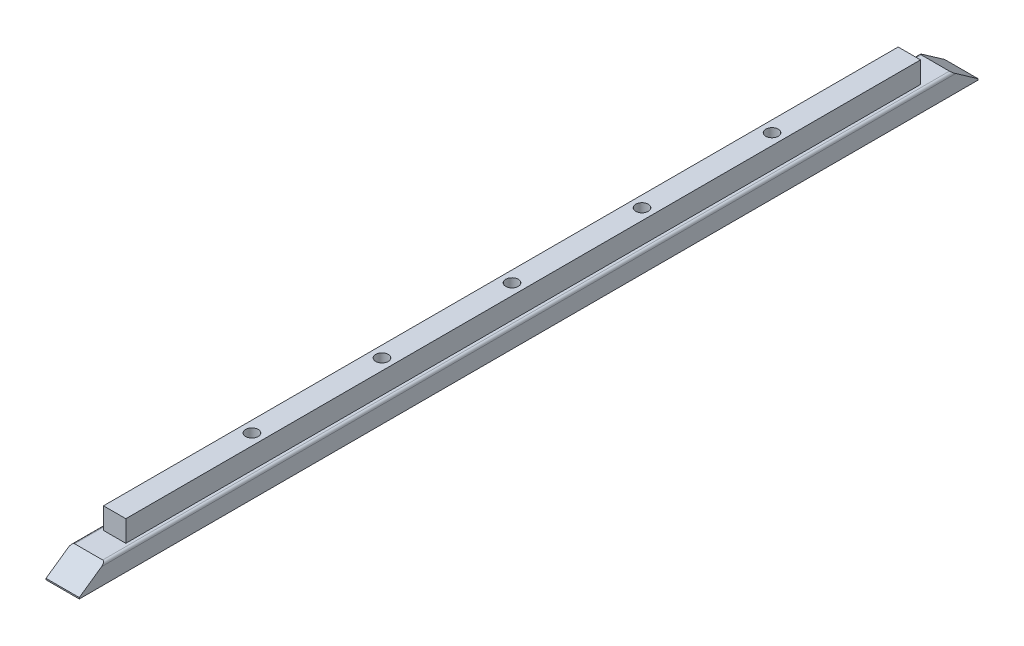
ISO-10303-21;
HEADER;
FILE_DESCRIPTION(('STEP AP214'),'2;1');
FILE_NAME('part.step','',(''),(''),'','','');
FILE_SCHEMA(('AUTOMOTIVE_DESIGN { 1 0 10303 214 1 1 1 1 }'));
ENDSEC;
DATA;
#1=APPLICATION_CONTEXT('core data for automotive mechanical design processes');
#2=APPLICATION_PROTOCOL_DEFINITION('international standard','automotive_design',2000,#1);
#3=PRODUCT_CONTEXT('',#1,'mechanical');
#4=PRODUCT('Part','Part','',(#3));
#5=PRODUCT_RELATED_PRODUCT_CATEGORY('part','',(#4));
#6=PRODUCT_DEFINITION_FORMATION('','',#4);
#7=PRODUCT_DEFINITION_CONTEXT('part definition',#1,'design');
#8=PRODUCT_DEFINITION('design','',#6,#7);
#9=PRODUCT_DEFINITION_SHAPE('','',#8);
#10=(LENGTH_UNIT() NAMED_UNIT(*) SI_UNIT(.MILLI.,.METRE.));
#11=(NAMED_UNIT(*) PLANE_ANGLE_UNIT() SI_UNIT($,.RADIAN.));
#12=(NAMED_UNIT(*) SI_UNIT($,.STERADIAN.) SOLID_ANGLE_UNIT());
#13=UNCERTAINTY_MEASURE_WITH_UNIT(LENGTH_MEASURE(1.E-05),#10,'distance_accuracy_value','');
#14=(GEOMETRIC_REPRESENTATION_CONTEXT(3) GLOBAL_UNCERTAINTY_ASSIGNED_CONTEXT((#13)) GLOBAL_UNIT_ASSIGNED_CONTEXT((#10,
#11,#12)) REPRESENTATION_CONTEXT('',''));
#15=CARTESIAN_POINT('',(0.,0.,0.));
#16=DIRECTION('',(0.,0.,1.));
#17=DIRECTION('',(1.,0.,0.));
#18=AXIS2_PLACEMENT_3D('',#15,#16,#17);
#19=CARTESIAN_POINT('',(2.39066431369243,3.75000000000887,176.480120000002));
#20=DIRECTION('',(2.39450679622574E-13,-1.,0.));
#21=DIRECTION('',(1.52957194753946E-07,0.,0.999999999999988));
#22=AXIS2_PLACEMENT_3D('',#19,#20,#21);
#23=PLANE('',#22);
#24=DIRECTION('',(-1.,-2.39450679622574E-13,0.));
#25=VECTOR('',#24,1.);
#26=CARTESIAN_POINT('',(2.39066431369243,3.75000000001107,-5.));
#27=LINE('',#26,#25);
#28=CARTESIAN_POINT('',(2.69999999999988,3.75000000001115,-5.));
#29=VERTEX_POINT('',#28);
#30=CARTESIAN_POINT('',(-2.70000000000012,3.75000000000985,-5.));
#31=VERTEX_POINT('',#30);
#32=EDGE_CURVE('E192',#29,#31,#27,.T.);
#33=ORIENTED_EDGE('',*,*,#32,.T.);
#34=DIRECTION('',(0.,0.,-1.));
#35=VECTOR('',#34,1.);
#36=CARTESIAN_POINT('',(-2.70000000000012,3.75000000000766,176.480120000002));
#37=LINE('',#36,#35);
#38=CARTESIAN_POINT('',(-2.70000000000012,3.75000000000788,157.800000000001));
#39=VERTEX_POINT('',#38);
#40=EDGE_CURVE('E215',#31,#39,#37,.F.);
#41=ORIENTED_EDGE('',*,*,#40,.T.);
#42=DIRECTION('',(1.,2.39450679622574E-13,0.));
#43=VECTOR('',#42,1.);
#44=CARTESIAN_POINT('',(2.39066431369243,3.7500000000091,157.800000000001));
#45=LINE('',#44,#43);
#46=CARTESIAN_POINT('',(2.69999999999989,3.75000000000917,157.800000000001));
#47=VERTEX_POINT('',#46);
#48=EDGE_CURVE('E195',#39,#47,#45,.T.);
#49=ORIENTED_EDGE('',*,*,#48,.T.);
#50=DIRECTION('',(0.,0.,1.));
#51=VECTOR('',#50,1.);
#52=CARTESIAN_POINT('',(2.69999999999989,3.75000000000895,176.480120000002));
#53=LINE('',#52,#51);
#54=EDGE_CURVE('E213',#47,#29,#53,.F.);
#55=ORIENTED_EDGE('',*,*,#54,.T.);
#56=EDGE_LOOP('',(#33,#41,#49,#55));
#57=FACE_BOUND('',#56,.T.);
#58=DIRECTION('',(0.,0.,1.));
#59=VECTOR('',#58,1.);
#60=CARTESIAN_POINT('',(-2.15000000001858,3.75000000000992,0.));
#61=LINE('',#60,#59);
#62=CARTESIAN_POINT('',(-2.15000000001858,3.75000000000992,0.));
#63=VERTEX_POINT('',#62);
#64=CARTESIAN_POINT('',(-2.15000000001954,3.75000000000807,152.800000000001));
#65=VERTEX_POINT('',#64);
#66=EDGE_CURVE('E158',#63,#65,#61,.T.);
#67=ORIENTED_EDGE('',*,*,#66,.F.);
#68=DIRECTION('',(-1.,-2.39432182091122E-13,0.));
#69=VECTOR('',#68,1.);
#70=CARTESIAN_POINT('',(-2.15000000001858,3.75000000000992,0.));
#71=LINE('',#70,#69);
#72=CARTESIAN_POINT('',(2.14999999998312,3.75000000001095,0.));
#73=VERTEX_POINT('',#72);
#74=EDGE_CURVE('E136',#73,#63,#71,.T.);
#75=ORIENTED_EDGE('',*,*,#74,.F.);
#76=DIRECTION('',(0.,0.,-1.));
#77=VECTOR('',#76,1.);
#78=CARTESIAN_POINT('',(2.14999999998312,3.75000000001095,0.));
#79=LINE('',#78,#77);
#80=CARTESIAN_POINT('',(2.14999999998314,3.7500000000091,152.800000000001));
#81=VERTEX_POINT('',#80);
#82=EDGE_CURVE('E61',#81,#73,#79,.T.);
#83=ORIENTED_EDGE('',*,*,#82,.F.);
#84=DIRECTION('',(1.,2.39432182091122E-13,0.));
#85=VECTOR('',#84,1.);
#86=CARTESIAN_POINT('',(-2.15000000001856,3.75000000000807,152.800000000001));
#87=LINE('',#86,#85);
#88=EDGE_CURVE('E56',#65,#81,#87,.T.);
#89=ORIENTED_EDGE('',*,*,#88,.F.);
#90=EDGE_LOOP('',(#67,#75,#83,#89));
#91=FACE_BOUND('',#90,.T.);
#92=ADVANCED_FACE('F41',(#57,#91),#23,.F.);
#93=CARTESIAN_POINT('',(0.,0.,0.));
#94=DIRECTION('',(0.,-1.,0.));
#95=DIRECTION('',(0.,0.,-1.));
#96=AXIS2_PLACEMENT_3D('',#93,#94,#95);
#97=PLANE('',#96);
#98=CARTESIAN_POINT('',(0.,0.,26.4000000000003));
#99=DIRECTION('',(0.,-1.,0.));
#100=DIRECTION('',(0.,0.,-1.));
#101=AXIS2_PLACEMENT_3D('',#98,#99,#100);
#102=CIRCLE('',#101,2.2);
#103=CARTESIAN_POINT('',(0.,0.,24.2000000000003));
#104=VERTEX_POINT('',#103);
#105=EDGE_CURVE('E334',#104,#104,#102,.T.);
#106=ORIENTED_EDGE('',*,*,#105,.F.);
#107=EDGE_LOOP('',(#106));
#108=FACE_BOUND('',#107,.T.);
#109=CARTESIAN_POINT('',(0.,0.,51.4000000000003));
#110=DIRECTION('',(0.,-1.,0.));
#111=DIRECTION('',(0.,0.,-1.));
#112=AXIS2_PLACEMENT_3D('',#109,#110,#111);
#113=CIRCLE('',#112,2.2);
#114=CARTESIAN_POINT('',(0.,0.,49.2000000000003));
#115=VERTEX_POINT('',#114);
#116=EDGE_CURVE('E341',#115,#115,#113,.T.);
#117=ORIENTED_EDGE('',*,*,#116,.F.);
#118=EDGE_LOOP('',(#117));
#119=FACE_BOUND('',#118,.T.);
#120=CARTESIAN_POINT('',(0.,0.,126.4));
#121=DIRECTION('',(0.,-1.,0.));
#122=DIRECTION('',(0.,0.,-1.));
#123=AXIS2_PLACEMENT_3D('',#120,#121,#122);
#124=CIRCLE('',#123,2.2);
#125=CARTESIAN_POINT('',(0.,0.,124.2));
#126=VERTEX_POINT('',#125);
#127=EDGE_CURVE('E350',#126,#126,#124,.T.);
#128=ORIENTED_EDGE('',*,*,#127,.F.);
#129=EDGE_LOOP('',(#128));
#130=FACE_BOUND('',#129,.T.);
#131=CARTESIAN_POINT('',(0.,0.,101.4));
#132=DIRECTION('',(0.,-1.,0.));
#133=DIRECTION('',(0.,0.,-1.));
#134=AXIS2_PLACEMENT_3D('',#131,#132,#133);
#135=CIRCLE('',#134,2.2);
#136=CARTESIAN_POINT('',(0.,0.,99.2000000000003));
#137=VERTEX_POINT('',#136);
#138=EDGE_CURVE('E359',#137,#137,#135,.T.);
#139=ORIENTED_EDGE('',*,*,#138,.F.);
#140=EDGE_LOOP('',(#139));
#141=FACE_BOUND('',#140,.T.);
#142=CARTESIAN_POINT('',(0.,0.,76.4000000000003));
#143=DIRECTION('',(0.,-1.,0.));
#144=DIRECTION('',(0.,0.,-1.));
#145=AXIS2_PLACEMENT_3D('',#142,#143,#144);
#146=CIRCLE('',#145,2.2);
#147=CARTESIAN_POINT('',(0.,0.,74.2000000000003));
#148=VERTEX_POINT('',#147);
#149=EDGE_CURVE('E368',#148,#148,#146,.T.);
#150=ORIENTED_EDGE('',*,*,#149,.F.);
#151=EDGE_LOOP('',(#150));
#152=FACE_BOUND('',#151,.T.);
#153=DIRECTION('',(0.,0.,-1.));
#154=VECTOR('',#153,1.);
#155=CARTESIAN_POINT('',(3.20000000000001,0.,162.800000000001));
#156=LINE('',#155,#154);
#157=CARTESIAN_POINT('',(3.20000000000001,0.,162.800000000001));
#158=VERTEX_POINT('',#157);
#159=CARTESIAN_POINT('',(3.2,0.,-10.));
#160=VERTEX_POINT('',#159);
#161=EDGE_CURVE('E151',#158,#160,#156,.T.);
#162=ORIENTED_EDGE('',*,*,#161,.F.);
#163=DIRECTION('',(1.,0.,0.));
#164=VECTOR('',#163,1.);
#165=CARTESIAN_POINT('',(-3.2,0.,162.800000000001));
#166=LINE('',#165,#164);
#167=CARTESIAN_POINT('',(-3.2,0.,162.800000000001));
#168=VERTEX_POINT('',#167);
#169=EDGE_CURVE('E173',#168,#158,#166,.T.);
#170=ORIENTED_EDGE('',*,*,#169,.F.);
#171=DIRECTION('',(0.,0.,1.));
#172=VECTOR('',#171,1.);
#173=CARTESIAN_POINT('',(-3.2,0.,162.800000000001));
#174=LINE('',#173,#172);
#175=CARTESIAN_POINT('',(-3.2,0.,-10.));
#176=VERTEX_POINT('',#175);
#177=EDGE_CURVE('E170',#176,#168,#174,.T.);
#178=ORIENTED_EDGE('',*,*,#177,.F.);
#179=DIRECTION('',(-1.,0.,0.));
#180=VECTOR('',#179,1.);
#181=CARTESIAN_POINT('',(-3.2,0.,-10.));
#182=LINE('',#181,#180);
#183=EDGE_CURVE('E154',#160,#176,#182,.T.);
#184=ORIENTED_EDGE('',*,*,#183,.F.);
#185=EDGE_LOOP('',(#162,#170,#178,#184));
#186=FACE_BOUND('',#185,.T.);
#187=ADVANCED_FACE('F251',(#108,#119,#130,#141,#152,#186),#97,.T.);
#188=CARTESIAN_POINT('',(-3.2,176.768477902171,162.800000000001));
#189=DIRECTION('',(0.,0.,-1.));
#190=DIRECTION('',(-1.,0.,0.));
#191=AXIS2_PLACEMENT_3D('',#188,#189,#190);
#192=PLANE('',#191);
#193=DIRECTION('',(0.,-1.,0.));
#194=VECTOR('',#193,1.);
#195=CARTESIAN_POINT('',(3.20000000000001,176.768477902171,162.800000000001));
#196=LINE('',#195,#194);
#197=CARTESIAN_POINT('',(3.20000000000001,0.248962308960682,162.800000000001));
#198=VERTEX_POINT('',#197);
#199=EDGE_CURVE('E176',#198,#158,#196,.T.);
#200=ORIENTED_EDGE('',*,*,#199,.F.);
#201=DIRECTION('',(-1.,-2.39450679622574E-13,0.));
#202=VECTOR('',#201,1.);
#203=CARTESIAN_POINT('',(-3.19999999995773,0.248962308959155,162.800000000001));
#204=LINE('',#203,#202);
#205=CARTESIAN_POINT('',(-3.2,0.248962308959155,162.800000000001));
#206=VERTEX_POINT('',#205);
#207=EDGE_CURVE('E184',#198,#206,#204,.T.);
#208=ORIENTED_EDGE('',*,*,#207,.T.);
#209=DIRECTION('',(0.,-1.,0.));
#210=VECTOR('',#209,1.);
#211=CARTESIAN_POINT('',(-3.2,176.768477902171,162.800000000001));
#212=LINE('',#211,#210);
#213=EDGE_CURVE('E178',#206,#168,#212,.T.);
#214=ORIENTED_EDGE('',*,*,#213,.T.);
#215=ORIENTED_EDGE('',*,*,#169,.T.);
#216=EDGE_LOOP('',(#200,#208,#214,#215));
#217=FACE_BOUND('',#216,.T.);
#218=ADVANCED_FACE('F255',(#217),#192,.F.);
#219=CARTESIAN_POINT('',(-3.2,176.768477902171,162.800000000001));
#220=DIRECTION('',(1.,0.,0.));
#221=DIRECTION('',(0.,0.,-1.));
#222=AXIS2_PLACEMENT_3D('',#219,#220,#221);
#223=PLANE('',#222);
#224=DIRECTION('',(0.,-0.573576436351052,0.819152044288988));
#225=VECTOR('',#224,1.);
#226=CARTESIAN_POINT('',(-3.2,0.248962308959155,162.800000000001));
#227=LINE('',#226,#225);
#228=CARTESIAN_POINT('',(-3.2,3.25000000000789,158.514074003372));
#229=VERTEX_POINT('',#228);
#230=EDGE_CURVE('E189',#206,#229,#227,.F.);
#231=ORIENTED_EDGE('',*,*,#230,.T.);
#232=DIRECTION('',(0.,0.,-1.));
#233=VECTOR('',#232,1.);
#234=CARTESIAN_POINT('',(-3.2,3.25000000000783,162.799999999999));
#235=LINE('',#234,#233);
#236=CARTESIAN_POINT('',(-3.2,3.25000000000987,-5.71407400337089));
#237=VERTEX_POINT('',#236);
#238=EDGE_CURVE('E206',#229,#237,#235,.T.);
#239=ORIENTED_EDGE('',*,*,#238,.T.);
#240=DIRECTION('',(0.,0.573576436351035,0.819152044289));
#241=VECTOR('',#240,1.);
#242=CARTESIAN_POINT('',(-3.2,0.248962308961292,-10.));
#243=LINE('',#242,#241);
#244=CARTESIAN_POINT('',(-3.2,0.248962308961292,-10.));
#245=VERTEX_POINT('',#244);
#246=EDGE_CURVE('E187',#237,#245,#243,.F.);
#247=ORIENTED_EDGE('',*,*,#246,.T.);
#248=DIRECTION('',(0.,-1.,0.));
#249=VECTOR('',#248,1.);
#250=CARTESIAN_POINT('',(-3.2,176.768477902171,-10.));
#251=LINE('',#250,#249);
#252=EDGE_CURVE('E180',#245,#176,#251,.T.);
#253=ORIENTED_EDGE('',*,*,#252,.T.);
#254=ORIENTED_EDGE('',*,*,#177,.T.);
#255=ORIENTED_EDGE('',*,*,#213,.F.);
#256=EDGE_LOOP('',(#231,#239,#247,#253,#254,#255));
#257=FACE_BOUND('',#256,.T.);
#258=ADVANCED_FACE('F228',(#257),#223,.F.);
#259=CARTESIAN_POINT('',(-3.2,176.768477902171,-10.));
#260=DIRECTION('',(0.,0.,1.));
#261=DIRECTION('',(1.,0.,0.));
#262=AXIS2_PLACEMENT_3D('',#259,#260,#261);
#263=PLANE('',#262);
#264=ORIENTED_EDGE('',*,*,#252,.F.);
#265=DIRECTION('',(1.,2.39450679622574E-13,0.));
#266=VECTOR('',#265,1.);
#267=CARTESIAN_POINT('',(-3.19999999995774,0.248962308961292,-10.));
#268=LINE('',#267,#266);
#269=CARTESIAN_POINT('',(3.2,0.248962308962819,-10.));
#270=VERTEX_POINT('',#269);
#271=EDGE_CURVE('E203',#245,#270,#268,.T.);
#272=ORIENTED_EDGE('',*,*,#271,.T.);
#273=DIRECTION('',(0.,-1.,0.));
#274=VECTOR('',#273,1.);
#275=CARTESIAN_POINT('',(3.2,176.768477902171,-10.));
#276=LINE('',#275,#274);
#277=EDGE_CURVE('E182',#270,#160,#276,.T.);
#278=ORIENTED_EDGE('',*,*,#277,.T.);
#279=ORIENTED_EDGE('',*,*,#183,.T.);
#280=EDGE_LOOP('',(#264,#272,#278,#279));
#281=FACE_BOUND('',#280,.T.);
#282=ADVANCED_FACE('F248',(#281),#263,.F.);
#283=CARTESIAN_POINT('',(3.20000000000001,176.768477902171,162.800000000001));
#284=DIRECTION('',(-1.,0.,0.));
#285=DIRECTION('',(0.,0.,1.));
#286=AXIS2_PLACEMENT_3D('',#283,#284,#285);
#287=PLANE('',#286);
#288=DIRECTION('',(0.,-0.573576436351035,-0.819152044289));
#289=VECTOR('',#288,1.);
#290=CARTESIAN_POINT('',(3.2,0.248962308962321,-10.0000000000007));
#291=LINE('',#290,#289);
#292=CARTESIAN_POINT('',(3.2,3.25000000001118,-5.71407400337121));
#293=VERTEX_POINT('',#292);
#294=EDGE_CURVE('E198',#270,#293,#291,.F.);
#295=ORIENTED_EDGE('',*,*,#294,.T.);
#296=DIRECTION('',(0.,0.,1.));
#297=VECTOR('',#296,1.);
#298=CARTESIAN_POINT('',(3.20000000000001,3.25000000000913,162.799999999999));
#299=LINE('',#298,#297);
#300=CARTESIAN_POINT('',(3.20000000000001,3.25000000000919,158.514074003372));
#301=VERTEX_POINT('',#300);
#302=EDGE_CURVE('E12',#293,#301,#299,.T.);
#303=ORIENTED_EDGE('',*,*,#302,.T.);
#304=DIRECTION('',(0.,0.573576436351052,-0.819152044288988));
#305=VECTOR('',#304,1.);
#306=CARTESIAN_POINT('',(3.20000000000001,0.248962308960184,162.800000000001));
#307=LINE('',#306,#305);
#308=EDGE_CURVE('E201',#301,#198,#307,.F.);
#309=ORIENTED_EDGE('',*,*,#308,.T.);
#310=ORIENTED_EDGE('',*,*,#199,.T.);
#311=ORIENTED_EDGE('',*,*,#161,.T.);
#312=ORIENTED_EDGE('',*,*,#277,.F.);
#313=EDGE_LOOP('',(#295,#303,#309,#310,#311,#312));
#314=FACE_BOUND('',#313,.T.);
#315=ADVANCED_FACE('F242',(#314),#287,.F.);
#316=CARTESIAN_POINT('',(-3.19999999995773,0.248962308959155,162.800000000001));
#317=DIRECTION('',(1.96146513719219E-13,-0.819152044288988,-0.573576436351052));
#318=DIRECTION('',(-1.,-2.39450679622574E-13,0.));
#319=AXIS2_PLACEMENT_3D('',#316,#317,#318);
#320=PLANE('',#319);
#321=ORIENTED_EDGE('',*,*,#48,.F.);
#322=CARTESIAN_POINT('',(-2.7,3.25000000000788,158.514074003372));
#323=DIRECTION('',(1.96146513719219E-13,-0.819152044288988,-0.573576436351052));
#324=DIRECTION('',(-1.37367777989773E-13,0.573576436351052,-0.819152044288988));
#325=AXIS2_PLACEMENT_3D('',#322,#323,#324);
#326=ELLIPSE('',#325,0.871723397810555,0.5);
#327=EDGE_CURVE('E49',#39,#229,#326,.F.);
#328=ORIENTED_EDGE('',*,*,#327,.T.);
#329=ORIENTED_EDGE('',*,*,#230,.F.);
#330=ORIENTED_EDGE('',*,*,#207,.F.);
#331=ORIENTED_EDGE('',*,*,#308,.F.);
#332=CARTESIAN_POINT('',(2.70000000000001,3.25000000000919,158.514074003372));
#333=DIRECTION('',(1.96146513719219E-13,-0.819152044288988,-0.573576436351052));
#334=DIRECTION('',(1.37373905612279E-13,-0.573576436351052,0.819152044288988));
#335=AXIS2_PLACEMENT_3D('',#332,#333,#334);
#336=ELLIPSE('',#335,0.871723397810555,0.5);
#337=EDGE_CURVE('E217',#301,#47,#336,.F.);
#338=ORIENTED_EDGE('',*,*,#337,.T.);
#339=EDGE_LOOP('',(#321,#328,#329,#330,#331,#338));
#340=FACE_BOUND('',#339,.T.);
#341=ADVANCED_FACE('F221',(#340),#320,.F.);
#342=CARTESIAN_POINT('',(-3.19999999995774,0.248962308961292,-10.));
#343=DIRECTION('',(1.96146513719222E-13,-0.819152044289,0.573576436351035));
#344=DIRECTION('',(1.,2.39450679622574E-13,0.));
#345=AXIS2_PLACEMENT_3D('',#342,#343,#344);
#346=PLANE('',#345);
#347=ORIENTED_EDGE('',*,*,#246,.F.);
#348=CARTESIAN_POINT('',(-2.7,3.25000000000987,-5.71407400337107));
#349=DIRECTION('',(1.96146513719222E-13,-0.819152044289,0.573576436351035));
#350=DIRECTION('',(1.3731875700973E-13,-0.573576436351035,-0.819152044289));
#351=AXIS2_PLACEMENT_3D('',#348,#349,#350);
#352=ELLIPSE('',#351,0.871723397810551,0.5);
#353=EDGE_CURVE('E211',#237,#31,#352,.F.);
#354=ORIENTED_EDGE('',*,*,#353,.T.);
#355=ORIENTED_EDGE('',*,*,#32,.F.);
#356=CARTESIAN_POINT('',(2.7,3.25000000001118,-5.71407400337107));
#357=DIRECTION('',(1.96146513719222E-13,-0.819152044289,0.573576436351035));
#358=DIRECTION('',(-1.37312629387224E-13,0.573576436351035,0.819152044289));
#359=AXIS2_PLACEMENT_3D('',#356,#357,#358);
#360=ELLIPSE('',#359,0.871723397810551,0.5);
#361=EDGE_CURVE('E209',#29,#293,#360,.F.);
#362=ORIENTED_EDGE('',*,*,#361,.T.);
#363=ORIENTED_EDGE('',*,*,#294,.F.);
#364=ORIENTED_EDGE('',*,*,#271,.F.);
#365=EDGE_LOOP('',(#347,#354,#355,#362,#363,#364));
#366=FACE_BOUND('',#365,.T.);
#367=ADVANCED_FACE('F233',(#366),#346,.F.);
#368=CARTESIAN_POINT('',(-2.7,3.25000000000783,162.799999999999));
#369=DIRECTION('',(0.,0.,-1.));
#370=DIRECTION('',(0.,1.,0.));
#371=AXIS2_PLACEMENT_3D('',#368,#369,#370);
#372=CYLINDRICAL_SURFACE('',#371,0.5);
#373=ORIENTED_EDGE('',*,*,#327,.F.);
#374=ORIENTED_EDGE('',*,*,#40,.F.);
#375=ORIENTED_EDGE('',*,*,#353,.F.);
#376=ORIENTED_EDGE('',*,*,#238,.F.);
#377=EDGE_LOOP('',(#373,#374,#375,#376));
#378=FACE_BOUND('',#377,.T.);
#379=ADVANCED_FACE('F230',(#378),#372,.T.);
#380=CARTESIAN_POINT('',(2.70000000000001,3.25000000000913,162.799999999999));
#381=DIRECTION('',(0.,0.,1.));
#382=DIRECTION('',(0.,-1.,0.));
#383=AXIS2_PLACEMENT_3D('',#380,#381,#382);
#384=CYLINDRICAL_SURFACE('',#383,0.5);
#385=ORIENTED_EDGE('',*,*,#361,.F.);
#386=ORIENTED_EDGE('',*,*,#54,.F.);
#387=ORIENTED_EDGE('',*,*,#337,.F.);
#388=ORIENTED_EDGE('',*,*,#302,.F.);
#389=EDGE_LOOP('',(#385,#386,#387,#388));
#390=FACE_BOUND('',#389,.T.);
#391=ADVANCED_FACE('F43',(#390),#384,.T.);
#392=CARTESIAN_POINT('',(-2.1500000000564,161.710491952643,1.90973292248949E-12));
#393=DIRECTION('',(1.,2.39450679622574E-13,0.));
#394=DIRECTION('',(-2.39450679622574E-13,1.,0.));
#395=AXIS2_PLACEMENT_3D('',#392,#393,#394);
#396=PLANE('',#395);
#397=DIRECTION('',(0.,0.,1.));
#398=VECTOR('',#397,1.);
#399=CARTESIAN_POINT('',(-2.15000000001956,7.85000000001201,0.));
#400=LINE('',#399,#398);
#401=CARTESIAN_POINT('',(-2.1500000000564,7.85000000001201,0.));
#402=VERTEX_POINT('',#401);
#403=CARTESIAN_POINT('',(-2.15000000001954,7.85000000001071,152.800000000001));
#404=VERTEX_POINT('',#403);
#405=EDGE_CURVE('E146',#402,#404,#400,.T.);
#406=ORIENTED_EDGE('',*,*,#405,.F.);
#407=DIRECTION('',(2.39450679622574E-13,-1.,0.));
#408=VECTOR('',#407,1.);
#409=CARTESIAN_POINT('',(-2.1500000000564,161.710491952643,1.90973292248949E-12));
#410=LINE('',#409,#408);
#411=EDGE_CURVE('E142',#402,#63,#410,.T.);
#412=ORIENTED_EDGE('',*,*,#411,.T.);
#413=ORIENTED_EDGE('',*,*,#66,.T.);
#414=DIRECTION('',(2.39450679622574E-13,-1.,0.));
#415=VECTOR('',#414,1.);
#416=CARTESIAN_POINT('',(-2.15000000005639,161.710491952641,152.800000000003));
#417=LINE('',#416,#415);
#418=EDGE_CURVE('E162',#404,#65,#417,.T.);
#419=ORIENTED_EDGE('',*,*,#418,.F.);
#420=EDGE_LOOP('',(#406,#412,#413,#419));
#421=FACE_BOUND('',#420,.T.);
#422=ADVANCED_FACE('F277',(#421),#396,.F.);
#423=CARTESIAN_POINT('',(-2.15000000005639,161.710491952641,152.800000000003));
#424=DIRECTION('',(0.,0.,-1.));
#425=DIRECTION('',(0.,1.,0.));
#426=AXIS2_PLACEMENT_3D('',#423,#424,#425);
#427=PLANE('',#426);
#428=DIRECTION('',(1.,2.39450679622574E-13,0.));
#429=VECTOR('',#428,1.);
#430=CARTESIAN_POINT('',(-2.15000000001954,7.85000000001018,152.800000000001));
#431=LINE('',#430,#429);
#432=CARTESIAN_POINT('',(2.14999999998216,7.85000000001213,152.800000000001));
#433=VERTEX_POINT('',#432);
#434=EDGE_CURVE('E150',#404,#433,#431,.T.);
#435=ORIENTED_EDGE('',*,*,#434,.F.);
#436=ORIENTED_EDGE('',*,*,#418,.T.);
#437=ORIENTED_EDGE('',*,*,#88,.T.);
#438=DIRECTION('',(2.39450679622574E-13,-1.,0.));
#439=VECTOR('',#438,1.);
#440=CARTESIAN_POINT('',(2.14999999994532,161.710491952642,152.800000000003));
#441=LINE('',#440,#439);
#442=EDGE_CURVE('E164',#433,#81,#441,.T.);
#443=ORIENTED_EDGE('',*,*,#442,.F.);
#444=EDGE_LOOP('',(#435,#436,#437,#443));
#445=FACE_BOUND('',#444,.T.);
#446=ADVANCED_FACE('F279',(#445),#427,.F.);
#447=CARTESIAN_POINT('',(2.1499999999453,161.710491952644,1.9097329224895E-12));
#448=DIRECTION('',(-1.,-2.39450679622574E-13,0.));
#449=DIRECTION('',(2.39450679622574E-13,-1.,0.));
#450=AXIS2_PLACEMENT_3D('',#447,#448,#449);
#451=PLANE('',#450);
#452=DIRECTION('',(0.,0.,-1.));
#453=VECTOR('',#452,1.);
#454=CARTESIAN_POINT('',(2.14999999998214,7.85000000001304,0.));
#455=LINE('',#454,#453);
#456=CARTESIAN_POINT('',(2.14999999998214,7.85000000001254,0.));
#457=VERTEX_POINT('',#456);
#458=EDGE_CURVE('E132',#433,#457,#455,.T.);
#459=ORIENTED_EDGE('',*,*,#458,.F.);
#460=ORIENTED_EDGE('',*,*,#442,.T.);
#461=ORIENTED_EDGE('',*,*,#82,.T.);
#462=DIRECTION('',(2.39450679622574E-13,-1.,0.));
#463=VECTOR('',#462,1.);
#464=CARTESIAN_POINT('',(2.1499999999453,161.710491952644,1.9097329224895E-12));
#465=LINE('',#464,#463);
#466=EDGE_CURVE('E128',#457,#73,#465,.T.);
#467=ORIENTED_EDGE('',*,*,#466,.F.);
#468=EDGE_LOOP('',(#459,#460,#461,#467));
#469=FACE_BOUND('',#468,.T.);
#470=ADVANCED_FACE('F130',(#469),#451,.F.);
#471=CARTESIAN_POINT('',(-2.1500000000564,161.710491952643,1.90973292248949E-12));
#472=DIRECTION('',(0.,0.,1.));
#473=DIRECTION('',(0.,-1.,0.));
#474=AXIS2_PLACEMENT_3D('',#471,#472,#473);
#475=PLANE('',#474);
#476=DIRECTION('',(-1.,-2.39450679622574E-13,0.));
#477=VECTOR('',#476,1.);
#478=CARTESIAN_POINT('',(-2.15000000001956,7.85000000001201,0.));
#479=LINE('',#478,#477);
#480=EDGE_CURVE('E139',#457,#402,#479,.T.);
#481=ORIENTED_EDGE('',*,*,#480,.F.);
#482=ORIENTED_EDGE('',*,*,#466,.T.);
#483=ORIENTED_EDGE('',*,*,#74,.T.);
#484=ORIENTED_EDGE('',*,*,#411,.F.);
#485=EDGE_LOOP('',(#481,#482,#483,#484));
#486=FACE_BOUND('',#485,.T.);
#487=ADVANCED_FACE('F140',(#486),#475,.F.);
#488=CARTESIAN_POINT('',(-6.74941440157537,7.85000000001117,-20.0801199999985));
#489=DIRECTION('',(-2.39450679622574E-13,1.,0.));
#490=DIRECTION('',(0.999999999999988,2.39450681475695E-13,-1.52957194753946E-07));
#491=AXIS2_PLACEMENT_3D('',#488,#489,#490);
#492=PLANE('',#491);
#493=CARTESIAN_POINT('',(0.,7.85000000001304,26.4000000000003));
#494=DIRECTION('',(0.,-1.,0.));
#495=DIRECTION('',(0.,0.,-1.));
#496=AXIS2_PLACEMENT_3D('',#493,#494,#495);
#497=CIRCLE('',#496,1.2);
#498=CARTESIAN_POINT('',(0.,7.85000000001304,25.2000000000003));
#499=VERTEX_POINT('',#498);
#500=EDGE_CURVE('E336',#499,#499,#497,.T.);
#501=ORIENTED_EDGE('',*,*,#500,.T.);
#502=EDGE_LOOP('',(#501));
#503=FACE_BOUND('',#502,.T.);
#504=CARTESIAN_POINT('',(0.,7.85000000001304,51.4000000000003));
#505=DIRECTION('',(0.,-1.,0.));
#506=DIRECTION('',(0.,0.,-1.));
#507=AXIS2_PLACEMENT_3D('',#504,#505,#506);
#508=CIRCLE('',#507,1.2);
#509=CARTESIAN_POINT('',(0.,7.85000000001304,50.2000000000003));
#510=VERTEX_POINT('',#509);
#511=EDGE_CURVE('E347',#510,#510,#508,.T.);
#512=ORIENTED_EDGE('',*,*,#511,.T.);
#513=EDGE_LOOP('',(#512));
#514=FACE_BOUND('',#513,.T.);
#515=CARTESIAN_POINT('',(0.,7.85000000001304,126.4));
#516=DIRECTION('',(0.,-1.,0.));
#517=DIRECTION('',(0.,0.,-1.));
#518=AXIS2_PLACEMENT_3D('',#515,#516,#517);
#519=CIRCLE('',#518,1.2);
#520=CARTESIAN_POINT('',(0.,7.85000000001304,125.2));
#521=VERTEX_POINT('',#520);
#522=EDGE_CURVE('E356',#521,#521,#519,.T.);
#523=ORIENTED_EDGE('',*,*,#522,.T.);
#524=EDGE_LOOP('',(#523));
#525=FACE_BOUND('',#524,.T.);
#526=CARTESIAN_POINT('',(0.,7.85000000001304,101.4));
#527=DIRECTION('',(0.,-1.,0.));
#528=DIRECTION('',(0.,0.,-1.));
#529=AXIS2_PLACEMENT_3D('',#526,#527,#528);
#530=CIRCLE('',#529,1.2);
#531=CARTESIAN_POINT('',(0.,7.85000000001304,100.2));
#532=VERTEX_POINT('',#531);
#533=EDGE_CURVE('E365',#532,#532,#530,.T.);
#534=ORIENTED_EDGE('',*,*,#533,.T.);
#535=EDGE_LOOP('',(#534));
#536=FACE_BOUND('',#535,.T.);
#537=CARTESIAN_POINT('',(0.,7.85000000001304,76.4000000000003));
#538=DIRECTION('',(0.,-1.,0.));
#539=DIRECTION('',(0.,0.,-1.));
#540=AXIS2_PLACEMENT_3D('',#537,#538,#539);
#541=CIRCLE('',#540,1.2);
#542=CARTESIAN_POINT('',(0.,7.85000000001304,75.2000000000003));
#543=VERTEX_POINT('',#542);
#544=EDGE_CURVE('E166',#543,#543,#541,.T.);
#545=ORIENTED_EDGE('',*,*,#544,.T.);
#546=EDGE_LOOP('',(#545));
#547=FACE_BOUND('',#546,.T.);
#548=ORIENTED_EDGE('',*,*,#480,.T.);
#549=ORIENTED_EDGE('',*,*,#405,.T.);
#550=ORIENTED_EDGE('',*,*,#434,.T.);
#551=ORIENTED_EDGE('',*,*,#458,.T.);
#552=EDGE_LOOP('',(#548,#549,#550,#551));
#553=FACE_BOUND('',#552,.T.);
#554=ADVANCED_FACE('F149',(#503,#514,#525,#536,#547,#553),#492,.T.);
#555=CARTESIAN_POINT('',(0.,0.,76.4000000000003));
#556=DIRECTION('',(0.,-1.,0.));
#557=DIRECTION('',(0.,0.,-1.));
#558=AXIS2_PLACEMENT_3D('',#555,#556,#557);
#559=CYLINDRICAL_SURFACE('',#558,1.2);
#560=ORIENTED_EDGE('',*,*,#544,.F.);
#561=EDGE_LOOP('',(#560));
#562=FACE_BOUND('',#561,.T.);
#563=CARTESIAN_POINT('',(0.,1.,76.4000000000003));
#564=DIRECTION('',(0.,-1.,0.));
#565=DIRECTION('',(0.,0.,-1.));
#566=AXIS2_PLACEMENT_3D('',#563,#564,#565);
#567=CIRCLE('',#566,1.2);
#568=CARTESIAN_POINT('',(0.,1.,75.2000000000003));
#569=VERTEX_POINT('',#568);
#570=EDGE_CURVE('E371',#569,#569,#567,.T.);
#571=ORIENTED_EDGE('',*,*,#570,.T.);
#572=EDGE_LOOP('',(#571));
#573=FACE_BOUND('',#572,.T.);
#574=ADVANCED_FACE('F275',(#562,#573),#559,.F.);
#575=CARTESIAN_POINT('',(0.,0.,76.4000000000003));
#576=DIRECTION('',(0.,-1.,0.));
#577=DIRECTION('',(0.,0.,-1.));
#578=AXIS2_PLACEMENT_3D('',#575,#576,#577);
#579=CONICAL_SURFACE('',#578,2.2,0.785398163397447);
#580=ORIENTED_EDGE('',*,*,#570,.F.);
#581=EDGE_LOOP('',(#580));
#582=FACE_BOUND('',#581,.T.);
#583=ORIENTED_EDGE('',*,*,#149,.T.);
#584=EDGE_LOOP('',(#583));
#585=FACE_BOUND('',#584,.T.);
#586=ADVANCED_FACE('F290',(#582,#585),#579,.F.);
#587=CARTESIAN_POINT('',(0.,0.,101.4));
#588=DIRECTION('',(0.,-1.,0.));
#589=DIRECTION('',(0.,0.,-1.));
#590=AXIS2_PLACEMENT_3D('',#587,#588,#589);
#591=CYLINDRICAL_SURFACE('',#590,1.2);
#592=ORIENTED_EDGE('',*,*,#533,.F.);
#593=EDGE_LOOP('',(#592));
#594=FACE_BOUND('',#593,.T.);
#595=CARTESIAN_POINT('',(0.,1.,101.4));
#596=DIRECTION('',(0.,-1.,0.));
#597=DIRECTION('',(0.,0.,-1.));
#598=AXIS2_PLACEMENT_3D('',#595,#596,#597);
#599=CIRCLE('',#598,1.2);
#600=CARTESIAN_POINT('',(0.,1.,100.2));
#601=VERTEX_POINT('',#600);
#602=EDGE_CURVE('E362',#601,#601,#599,.T.);
#603=ORIENTED_EDGE('',*,*,#602,.T.);
#604=EDGE_LOOP('',(#603));
#605=FACE_BOUND('',#604,.T.);
#606=ADVANCED_FACE('F294',(#594,#605),#591,.F.);
#607=CARTESIAN_POINT('',(0.,0.,101.4));
#608=DIRECTION('',(0.,-1.,0.));
#609=DIRECTION('',(0.,0.,-1.));
#610=AXIS2_PLACEMENT_3D('',#607,#608,#609);
#611=CONICAL_SURFACE('',#610,2.2,0.785398163397447);
#612=ORIENTED_EDGE('',*,*,#602,.F.);
#613=EDGE_LOOP('',(#612));
#614=FACE_BOUND('',#613,.T.);
#615=ORIENTED_EDGE('',*,*,#138,.T.);
#616=EDGE_LOOP('',(#615));
#617=FACE_BOUND('',#616,.T.);
#618=ADVANCED_FACE('F298',(#614,#617),#611,.F.);
#619=CARTESIAN_POINT('',(0.,0.,126.4));
#620=DIRECTION('',(0.,-1.,0.));
#621=DIRECTION('',(0.,0.,-1.));
#622=AXIS2_PLACEMENT_3D('',#619,#620,#621);
#623=CYLINDRICAL_SURFACE('',#622,1.2);
#624=ORIENTED_EDGE('',*,*,#522,.F.);
#625=EDGE_LOOP('',(#624));
#626=FACE_BOUND('',#625,.T.);
#627=CARTESIAN_POINT('',(0.,1.,126.4));
#628=DIRECTION('',(0.,-1.,0.));
#629=DIRECTION('',(0.,0.,-1.));
#630=AXIS2_PLACEMENT_3D('',#627,#628,#629);
#631=CIRCLE('',#630,1.2);
#632=CARTESIAN_POINT('',(0.,1.,125.2));
#633=VERTEX_POINT('',#632);
#634=EDGE_CURVE('E353',#633,#633,#631,.T.);
#635=ORIENTED_EDGE('',*,*,#634,.T.);
#636=EDGE_LOOP('',(#635));
#637=FACE_BOUND('',#636,.T.);
#638=ADVANCED_FACE('F302',(#626,#637),#623,.F.);
#639=CARTESIAN_POINT('',(0.,0.,126.4));
#640=DIRECTION('',(0.,-1.,0.));
#641=DIRECTION('',(0.,0.,-1.));
#642=AXIS2_PLACEMENT_3D('',#639,#640,#641);
#643=CONICAL_SURFACE('',#642,2.2,0.785398163397447);
#644=ORIENTED_EDGE('',*,*,#634,.F.);
#645=EDGE_LOOP('',(#644));
#646=FACE_BOUND('',#645,.T.);
#647=ORIENTED_EDGE('',*,*,#127,.T.);
#648=EDGE_LOOP('',(#647));
#649=FACE_BOUND('',#648,.T.);
#650=ADVANCED_FACE('F306',(#646,#649),#643,.F.);
#651=CARTESIAN_POINT('',(0.,0.,51.4000000000003));
#652=DIRECTION('',(0.,-1.,0.));
#653=DIRECTION('',(0.,0.,-1.));
#654=AXIS2_PLACEMENT_3D('',#651,#652,#653);
#655=CYLINDRICAL_SURFACE('',#654,1.2);
#656=ORIENTED_EDGE('',*,*,#511,.F.);
#657=EDGE_LOOP('',(#656));
#658=FACE_BOUND('',#657,.T.);
#659=CARTESIAN_POINT('',(0.,1.,51.4000000000003));
#660=DIRECTION('',(0.,-1.,0.));
#661=DIRECTION('',(0.,0.,-1.));
#662=AXIS2_PLACEMENT_3D('',#659,#660,#661);
#663=CIRCLE('',#662,1.2);
#664=CARTESIAN_POINT('',(0.,1.,50.2000000000003));
#665=VERTEX_POINT('',#664);
#666=EDGE_CURVE('E344',#665,#665,#663,.T.);
#667=ORIENTED_EDGE('',*,*,#666,.T.);
#668=EDGE_LOOP('',(#667));
#669=FACE_BOUND('',#668,.T.);
#670=ADVANCED_FACE('F310',(#658,#669),#655,.F.);
#671=CARTESIAN_POINT('',(0.,0.,51.4000000000003));
#672=DIRECTION('',(0.,-1.,0.));
#673=DIRECTION('',(0.,0.,-1.));
#674=AXIS2_PLACEMENT_3D('',#671,#672,#673);
#675=CONICAL_SURFACE('',#674,2.2,0.785398163397447);
#676=ORIENTED_EDGE('',*,*,#666,.F.);
#677=EDGE_LOOP('',(#676));
#678=FACE_BOUND('',#677,.T.);
#679=ORIENTED_EDGE('',*,*,#116,.T.);
#680=EDGE_LOOP('',(#679));
#681=FACE_BOUND('',#680,.T.);
#682=ADVANCED_FACE('F314',(#678,#681),#675,.F.);
#683=CARTESIAN_POINT('',(0.,0.,26.4000000000003));
#684=DIRECTION('',(0.,-1.,0.));
#685=DIRECTION('',(0.,0.,-1.));
#686=AXIS2_PLACEMENT_3D('',#683,#684,#685);
#687=CYLINDRICAL_SURFACE('',#686,1.2);
#688=ORIENTED_EDGE('',*,*,#500,.F.);
#689=EDGE_LOOP('',(#688));
#690=FACE_BOUND('',#689,.T.);
#691=CARTESIAN_POINT('',(0.,1.,26.4000000000003));
#692=DIRECTION('',(0.,-1.,0.));
#693=DIRECTION('',(0.,0.,-1.));
#694=AXIS2_PLACEMENT_3D('',#691,#692,#693);
#695=CIRCLE('',#694,1.2);
#696=CARTESIAN_POINT('',(0.,1.,25.2000000000003));
#697=VERTEX_POINT('',#696);
#698=EDGE_CURVE('E331',#697,#697,#695,.T.);
#699=ORIENTED_EDGE('',*,*,#698,.T.);
#700=EDGE_LOOP('',(#699));
#701=FACE_BOUND('',#700,.T.);
#702=ADVANCED_FACE('F318',(#690,#701),#687,.F.);
#703=CARTESIAN_POINT('',(0.,0.,26.4000000000003));
#704=DIRECTION('',(0.,-1.,0.));
#705=DIRECTION('',(0.,0.,-1.));
#706=AXIS2_PLACEMENT_3D('',#703,#704,#705);
#707=CONICAL_SURFACE('',#706,2.2,0.785398163397447);
#708=ORIENTED_EDGE('',*,*,#698,.F.);
#709=EDGE_LOOP('',(#708));
#710=FACE_BOUND('',#709,.T.);
#711=ORIENTED_EDGE('',*,*,#105,.T.);
#712=EDGE_LOOP('',(#711));
#713=FACE_BOUND('',#712,.T.);
#714=ADVANCED_FACE('F322',(#710,#713),#707,.F.);
#715=CLOSED_SHELL('',(#92,#187,#218,#258,#282,#315,#341,#367,#379,#391,#422,#446,#470,#487,#554,
#574,#586,#606,#618,#638,#650,#670,#682,#702,#714));
#716=MANIFOLD_SOLID_BREP('B2',#715);
#717=ADVANCED_BREP_SHAPE_REPRESENTATION('',(#18,#716),#14);
#718=SHAPE_DEFINITION_REPRESENTATION(#9,#717);
ENDSEC;
END-ISO-10303-21;
